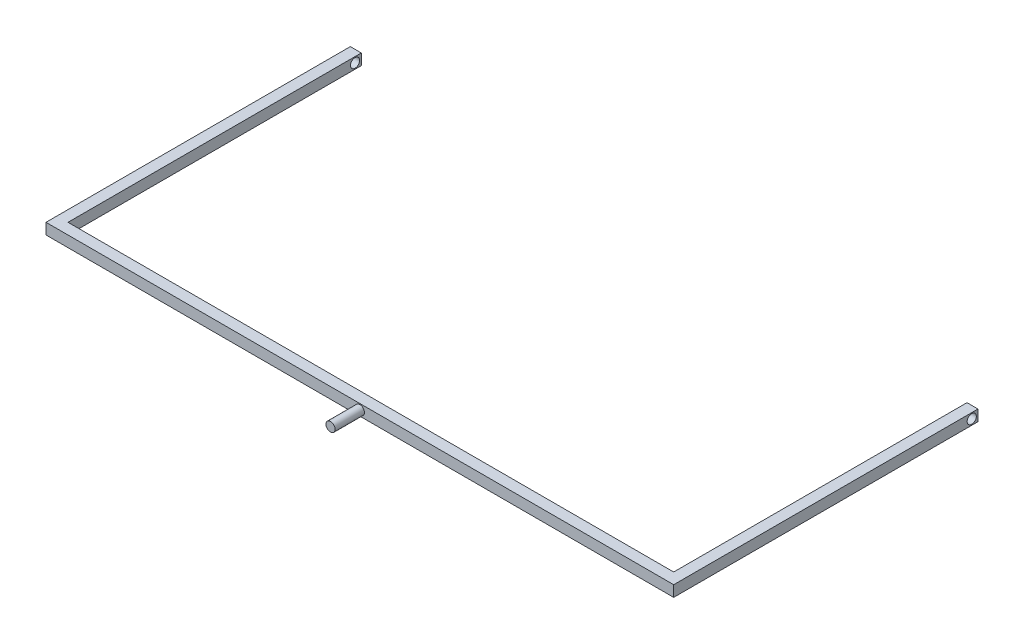
ISO-10303-21;
HEADER;
FILE_DESCRIPTION(('STEP AP214'),'2;1');
FILE_NAME('part.step','',(''),(''),'','','');
FILE_SCHEMA(('AUTOMOTIVE_DESIGN { 1 0 10303 214 1 1 1 1 }'));
ENDSEC;
DATA;
#1=APPLICATION_CONTEXT('core data for automotive mechanical design processes');
#2=APPLICATION_PROTOCOL_DEFINITION('international standard','automotive_design',2000,#1);
#3=PRODUCT_CONTEXT('',#1,'mechanical');
#4=PRODUCT('Part','Part','',(#3));
#5=PRODUCT_RELATED_PRODUCT_CATEGORY('part','',(#4));
#6=PRODUCT_DEFINITION_FORMATION('','',#4);
#7=PRODUCT_DEFINITION_CONTEXT('part definition',#1,'design');
#8=PRODUCT_DEFINITION('design','',#6,#7);
#9=PRODUCT_DEFINITION_SHAPE('','',#8);
#10=(LENGTH_UNIT() NAMED_UNIT(*) SI_UNIT(.MILLI.,.METRE.));
#11=(NAMED_UNIT(*) PLANE_ANGLE_UNIT() SI_UNIT($,.RADIAN.));
#12=(NAMED_UNIT(*) SI_UNIT($,.STERADIAN.) SOLID_ANGLE_UNIT());
#13=UNCERTAINTY_MEASURE_WITH_UNIT(LENGTH_MEASURE(1.E-05),#10,'distance_accuracy_value','');
#14=(GEOMETRIC_REPRESENTATION_CONTEXT(3) GLOBAL_UNCERTAINTY_ASSIGNED_CONTEXT((#13)) GLOBAL_UNIT_ASSIGNED_CONTEXT((#10,
#11,#12)) REPRESENTATION_CONTEXT('',''));
#15=CARTESIAN_POINT('',(0.,0.,0.));
#16=DIRECTION('',(0.,0.,1.));
#17=DIRECTION('',(1.,0.,0.));
#18=AXIS2_PLACEMENT_3D('',#15,#16,#17);
#19=CARTESIAN_POINT('',(-641.999999999998,30.,0.));
#20=DIRECTION('',(1.,0.,0.));
#21=DIRECTION('',(0.,0.,-1.));
#22=AXIS2_PLACEMENT_3D('',#19,#20,#21);
#23=PLANE('',#22);
#24=CARTESIAN_POINT('',(-641.999999999998,15.,-813.));
#25=DIRECTION('',(-1.,0.,0.));
#26=DIRECTION('',(0.,0.,1.));
#27=AXIS2_PLACEMENT_3D('',#24,#25,#26);
#28=CIRCLE('',#27,12.5);
#29=CARTESIAN_POINT('',(-641.999999999998,15.,-800.5));
#30=VERTEX_POINT('',#29);
#31=EDGE_CURVE('E215',#30,#30,#28,.T.);
#32=ORIENTED_EDGE('',*,*,#31,.F.);
#33=EDGE_LOOP('',(#32));
#34=FACE_BOUND('',#33,.T.);
#35=DIRECTION('',(0.,0.,1.));
#36=VECTOR('',#35,1.);
#37=CARTESIAN_POINT('',(-641.999999999998,0.,0.));
#38=LINE('',#37,#36);
#39=CARTESIAN_POINT('',(-641.999999999998,0.,-830.));
#40=VERTEX_POINT('',#39);
#41=CARTESIAN_POINT('',(-641.999999999998,0.,0.));
#42=VERTEX_POINT('',#41);
#43=EDGE_CURVE('E144',#40,#42,#38,.T.);
#44=ORIENTED_EDGE('',*,*,#43,.T.);
#45=DIRECTION('',(0.,-1.,0.));
#46=VECTOR('',#45,1.);
#47=CARTESIAN_POINT('',(-641.999999999998,30.,0.));
#48=LINE('',#47,#46);
#49=CARTESIAN_POINT('',(-641.999999999998,30.,0.));
#50=VERTEX_POINT('',#49);
#51=EDGE_CURVE('E11',#50,#42,#48,.T.);
#52=ORIENTED_EDGE('',*,*,#51,.F.);
#53=DIRECTION('',(0.,0.,1.));
#54=VECTOR('',#53,1.);
#55=CARTESIAN_POINT('',(-641.999999999998,30.,0.));
#56=LINE('',#55,#54);
#57=CARTESIAN_POINT('',(-641.999999999998,30.,-830.));
#58=VERTEX_POINT('',#57);
#59=EDGE_CURVE('E167',#58,#50,#56,.T.);
#60=ORIENTED_EDGE('',*,*,#59,.F.);
#61=DIRECTION('',(0.,-1.,0.));
#62=VECTOR('',#61,1.);
#63=CARTESIAN_POINT('',(-641.999999999998,30.,-830.));
#64=LINE('',#63,#62);
#65=EDGE_CURVE('E140',#58,#40,#64,.T.);
#66=ORIENTED_EDGE('',*,*,#65,.T.);
#67=EDGE_LOOP('',(#44,#52,#60,#66));
#68=FACE_BOUND('',#67,.T.);
#69=ADVANCED_FACE('F42',(#34,#68),#23,.F.);
#70=CARTESIAN_POINT('',(1070.,30.,-1.31037207508767E-13));
#71=DIRECTION('',(0.,0.,-1.));
#72=DIRECTION('',(-1.,0.,0.));
#73=AXIS2_PLACEMENT_3D('',#70,#71,#72);
#74=PLANE('',#73);
#75=CARTESIAN_POINT('',(214.000000000002,15.,0.));
#76=DIRECTION('',(0.,0.,1.));
#77=DIRECTION('',(1.,0.,0.));
#78=AXIS2_PLACEMENT_3D('',#75,#76,#77);
#79=CIRCLE('',#78,12.5);
#80=CARTESIAN_POINT('',(226.500000000002,15.,0.));
#81=VERTEX_POINT('',#80);
#82=EDGE_CURVE('E220',#81,#81,#79,.T.);
#83=ORIENTED_EDGE('',*,*,#82,.F.);
#84=EDGE_LOOP('',(#83));
#85=FACE_BOUND('',#84,.T.);
#86=DIRECTION('',(1.,0.,0.));
#87=VECTOR('',#86,1.);
#88=CARTESIAN_POINT('',(1070.,0.,-1.31037207508767E-13));
#89=LINE('',#88,#87);
#90=CARTESIAN_POINT('',(1070.,0.,-1.31037207508767E-13));
#91=VERTEX_POINT('',#90);
#92=EDGE_CURVE('E148',#42,#91,#89,.T.);
#93=ORIENTED_EDGE('',*,*,#92,.T.);
#94=DIRECTION('',(0.,-1.,0.));
#95=VECTOR('',#94,1.);
#96=CARTESIAN_POINT('',(1070.,30.,-1.31037207508767E-13));
#97=LINE('',#96,#95);
#98=CARTESIAN_POINT('',(1070.,30.,-1.31037207508767E-13));
#99=VERTEX_POINT('',#98);
#100=EDGE_CURVE('E52',#99,#91,#97,.T.);
#101=ORIENTED_EDGE('',*,*,#100,.F.);
#102=DIRECTION('',(1.,0.,0.));
#103=VECTOR('',#102,1.);
#104=CARTESIAN_POINT('',(1070.,30.,-1.31037207508767E-13));
#105=LINE('',#104,#103);
#106=EDGE_CURVE('E103',#50,#99,#105,.T.);
#107=ORIENTED_EDGE('',*,*,#106,.F.);
#108=ORIENTED_EDGE('',*,*,#51,.T.);
#109=EDGE_LOOP('',(#93,#101,#107,#108));
#110=FACE_BOUND('',#109,.T.);
#111=ADVANCED_FACE('F244',(#85,#110),#74,.F.);
#112=CARTESIAN_POINT('',(1070.,30.,-1.31037207508767E-13));
#113=DIRECTION('',(-1.,0.,0.));
#114=DIRECTION('',(0.,0.,1.));
#115=AXIS2_PLACEMENT_3D('',#112,#113,#114);
#116=PLANE('',#115);
#117=CARTESIAN_POINT('',(1070.,15.,-813.));
#118=DIRECTION('',(-1.,0.,0.));
#119=DIRECTION('',(0.,0.,1.));
#120=AXIS2_PLACEMENT_3D('',#117,#118,#119);
#121=CIRCLE('',#120,12.5);
#122=CARTESIAN_POINT('',(1070.,15.,-800.5));
#123=VERTEX_POINT('',#122);
#124=EDGE_CURVE('E219',#123,#123,#121,.T.);
#125=ORIENTED_EDGE('',*,*,#124,.T.);
#126=EDGE_LOOP('',(#125));
#127=FACE_BOUND('',#126,.T.);
#128=DIRECTION('',(0.,0.,-1.));
#129=VECTOR('',#128,1.);
#130=CARTESIAN_POINT('',(1070.,0.,-1.31037207508767E-13));
#131=LINE('',#130,#129);
#132=CARTESIAN_POINT('',(1070.,0.,-830.));
#133=VERTEX_POINT('',#132);
#134=EDGE_CURVE('E152',#91,#133,#131,.T.);
#135=ORIENTED_EDGE('',*,*,#134,.T.);
#136=DIRECTION('',(0.,-1.,0.));
#137=VECTOR('',#136,1.);
#138=CARTESIAN_POINT('',(1070.,30.,-830.));
#139=LINE('',#138,#137);
#140=CARTESIAN_POINT('',(1070.,30.,-830.));
#141=VERTEX_POINT('',#140);
#142=EDGE_CURVE('E178',#141,#133,#139,.T.);
#143=ORIENTED_EDGE('',*,*,#142,.F.);
#144=DIRECTION('',(0.,0.,-1.));
#145=VECTOR('',#144,1.);
#146=CARTESIAN_POINT('',(1070.,30.,-1.31037207508767E-13));
#147=LINE('',#146,#145);
#148=EDGE_CURVE('E189',#99,#141,#147,.T.);
#149=ORIENTED_EDGE('',*,*,#148,.F.);
#150=ORIENTED_EDGE('',*,*,#100,.T.);
#151=EDGE_LOOP('',(#135,#143,#149,#150));
#152=FACE_BOUND('',#151,.T.);
#153=ADVANCED_FACE('F187',(#127,#152),#116,.F.);
#154=CARTESIAN_POINT('',(1070.,30.,-830.));
#155=DIRECTION('',(0.,0.,1.));
#156=DIRECTION('',(1.,0.,0.));
#157=AXIS2_PLACEMENT_3D('',#154,#155,#156);
#158=PLANE('',#157);
#159=DIRECTION('',(-1.,0.,0.));
#160=VECTOR('',#159,1.);
#161=CARTESIAN_POINT('',(1070.,0.,-830.));
#162=LINE('',#161,#160);
#163=CARTESIAN_POINT('',(1040.,0.,-830.));
#164=VERTEX_POINT('',#163);
#165=EDGE_CURVE('E155',#133,#164,#162,.T.);
#166=ORIENTED_EDGE('',*,*,#165,.T.);
#167=DIRECTION('',(0.,-1.,0.));
#168=VECTOR('',#167,1.);
#169=CARTESIAN_POINT('',(1040.,30.,-830.));
#170=LINE('',#169,#168);
#171=CARTESIAN_POINT('',(1040.,30.,-830.));
#172=VERTEX_POINT('',#171);
#173=EDGE_CURVE('E174',#172,#164,#170,.T.);
#174=ORIENTED_EDGE('',*,*,#173,.F.);
#175=DIRECTION('',(-1.,0.,0.));
#176=VECTOR('',#175,1.);
#177=CARTESIAN_POINT('',(1070.,30.,-830.));
#178=LINE('',#177,#176);
#179=EDGE_CURVE('E202',#141,#172,#178,.T.);
#180=ORIENTED_EDGE('',*,*,#179,.F.);
#181=ORIENTED_EDGE('',*,*,#142,.T.);
#182=EDGE_LOOP('',(#166,#174,#180,#181));
#183=FACE_BOUND('',#182,.T.);
#184=ADVANCED_FACE('F197',(#183),#158,.F.);
#185=CARTESIAN_POINT('',(1040.,30.,-830.));
#186=DIRECTION('',(1.,0.,0.));
#187=DIRECTION('',(0.,0.,-1.));
#188=AXIS2_PLACEMENT_3D('',#185,#186,#187);
#189=PLANE('',#188);
#190=CARTESIAN_POINT('',(1040.,15.,-813.));
#191=DIRECTION('',(1.,0.,0.));
#192=DIRECTION('',(0.,0.,-1.));
#193=AXIS2_PLACEMENT_3D('',#190,#191,#192);
#194=CIRCLE('',#193,12.5);
#195=CARTESIAN_POINT('',(1040.,15.,-825.5));
#196=VERTEX_POINT('',#195);
#197=EDGE_CURVE('E149',#196,#196,#194,.T.);
#198=ORIENTED_EDGE('',*,*,#197,.T.);
#199=EDGE_LOOP('',(#198));
#200=FACE_BOUND('',#199,.T.);
#201=DIRECTION('',(0.,0.,1.));
#202=VECTOR('',#201,1.);
#203=CARTESIAN_POINT('',(1040.,0.,-830.));
#204=LINE('',#203,#202);
#205=CARTESIAN_POINT('',(1040.,0.,-29.9999999999998));
#206=VERTEX_POINT('',#205);
#207=EDGE_CURVE('E158',#164,#206,#204,.T.);
#208=ORIENTED_EDGE('',*,*,#207,.T.);
#209=DIRECTION('',(0.,-1.,0.));
#210=VECTOR('',#209,1.);
#211=CARTESIAN_POINT('',(1040.,30.,-29.9999999999998));
#212=LINE('',#211,#210);
#213=CARTESIAN_POINT('',(1040.,30.,-29.9999999999998));
#214=VERTEX_POINT('',#213);
#215=EDGE_CURVE('E133',#214,#206,#212,.T.);
#216=ORIENTED_EDGE('',*,*,#215,.F.);
#217=DIRECTION('',(0.,0.,1.));
#218=VECTOR('',#217,1.);
#219=CARTESIAN_POINT('',(1040.,30.,-830.));
#220=LINE('',#219,#218);
#221=EDGE_CURVE('E122',#172,#214,#220,.T.);
#222=ORIENTED_EDGE('',*,*,#221,.F.);
#223=ORIENTED_EDGE('',*,*,#173,.T.);
#224=EDGE_LOOP('',(#208,#216,#222,#223));
#225=FACE_BOUND('',#224,.T.);
#226=ADVANCED_FACE('F200',(#200,#225),#189,.F.);
#227=CARTESIAN_POINT('',(-611.999999999998,30.,-29.9999999999998));
#228=DIRECTION('',(0.,0.,1.));
#229=DIRECTION('',(1.,0.,0.));
#230=AXIS2_PLACEMENT_3D('',#227,#228,#229);
#231=PLANE('',#230);
#232=DIRECTION('',(-1.,0.,0.));
#233=VECTOR('',#232,1.);
#234=CARTESIAN_POINT('',(-611.999999999998,0.,-29.9999999999998));
#235=LINE('',#234,#233);
#236=CARTESIAN_POINT('',(-611.999999999998,0.,-29.9999999999998));
#237=VERTEX_POINT('',#236);
#238=EDGE_CURVE('E131',#206,#237,#235,.T.);
#239=ORIENTED_EDGE('',*,*,#238,.T.);
#240=DIRECTION('',(0.,-1.,0.));
#241=VECTOR('',#240,1.);
#242=CARTESIAN_POINT('',(-611.999999999998,30.,-29.9999999999998));
#243=LINE('',#242,#241);
#244=CARTESIAN_POINT('',(-611.999999999998,30.,-29.9999999999998));
#245=VERTEX_POINT('',#244);
#246=EDGE_CURVE('E128',#245,#237,#243,.T.);
#247=ORIENTED_EDGE('',*,*,#246,.F.);
#248=DIRECTION('',(-1.,0.,0.));
#249=VECTOR('',#248,1.);
#250=CARTESIAN_POINT('',(-611.999999999998,30.,-29.9999999999998));
#251=LINE('',#250,#249);
#252=EDGE_CURVE('E116',#214,#245,#251,.T.);
#253=ORIENTED_EDGE('',*,*,#252,.F.);
#254=ORIENTED_EDGE('',*,*,#215,.T.);
#255=EDGE_LOOP('',(#239,#247,#253,#254));
#256=FACE_BOUND('',#255,.T.);
#257=ADVANCED_FACE('F129',(#256),#231,.F.);
#258=CARTESIAN_POINT('',(-611.999999999998,30.,-830.));
#259=DIRECTION('',(-1.,0.,0.));
#260=DIRECTION('',(0.,0.,1.));
#261=AXIS2_PLACEMENT_3D('',#258,#259,#260);
#262=PLANE('',#261);
#263=CARTESIAN_POINT('',(-611.999999999998,15.,-813.));
#264=DIRECTION('',(-1.,0.,0.));
#265=DIRECTION('',(0.,0.,1.));
#266=AXIS2_PLACEMENT_3D('',#263,#264,#265);
#267=CIRCLE('',#266,12.5);
#268=CARTESIAN_POINT('',(-611.999999999998,15.,-800.5));
#269=VERTEX_POINT('',#268);
#270=EDGE_CURVE('E45',#269,#269,#267,.T.);
#271=ORIENTED_EDGE('',*,*,#270,.T.);
#272=EDGE_LOOP('',(#271));
#273=FACE_BOUND('',#272,.T.);
#274=DIRECTION('',(0.,0.,-1.));
#275=VECTOR('',#274,1.);
#276=CARTESIAN_POINT('',(-611.999999999998,0.,-830.));
#277=LINE('',#276,#275);
#278=CARTESIAN_POINT('',(-611.999999999998,0.,-830.));
#279=VERTEX_POINT('',#278);
#280=EDGE_CURVE('E89',#237,#279,#277,.T.);
#281=ORIENTED_EDGE('',*,*,#280,.T.);
#282=DIRECTION('',(0.,-1.,0.));
#283=VECTOR('',#282,1.);
#284=CARTESIAN_POINT('',(-611.999999999998,30.,-830.));
#285=LINE('',#284,#283);
#286=CARTESIAN_POINT('',(-611.999999999998,30.,-830.));
#287=VERTEX_POINT('',#286);
#288=EDGE_CURVE('E134',#287,#279,#285,.T.);
#289=ORIENTED_EDGE('',*,*,#288,.F.);
#290=DIRECTION('',(0.,0.,-1.));
#291=VECTOR('',#290,1.);
#292=CARTESIAN_POINT('',(-611.999999999998,30.,-830.));
#293=LINE('',#292,#291);
#294=EDGE_CURVE('E120',#245,#287,#293,.T.);
#295=ORIENTED_EDGE('',*,*,#294,.F.);
#296=ORIENTED_EDGE('',*,*,#246,.T.);
#297=EDGE_LOOP('',(#281,#289,#295,#296));
#298=FACE_BOUND('',#297,.T.);
#299=ADVANCED_FACE('F136',(#273,#298),#262,.F.);
#300=CARTESIAN_POINT('',(-641.999999999998,30.,-830.));
#301=DIRECTION('',(0.,0.,1.));
#302=DIRECTION('',(1.,0.,0.));
#303=AXIS2_PLACEMENT_3D('',#300,#301,#302);
#304=PLANE('',#303);
#305=DIRECTION('',(-1.,0.,0.));
#306=VECTOR('',#305,1.);
#307=CARTESIAN_POINT('',(-641.999999999998,0.,-830.));
#308=LINE('',#307,#306);
#309=EDGE_CURVE('E95',#279,#40,#308,.T.);
#310=ORIENTED_EDGE('',*,*,#309,.T.);
#311=ORIENTED_EDGE('',*,*,#65,.F.);
#312=DIRECTION('',(-1.,0.,0.));
#313=VECTOR('',#312,1.);
#314=CARTESIAN_POINT('',(-641.999999999998,30.,-830.));
#315=LINE('',#314,#313);
#316=EDGE_CURVE('E60',#287,#58,#315,.T.);
#317=ORIENTED_EDGE('',*,*,#316,.F.);
#318=ORIENTED_EDGE('',*,*,#288,.T.);
#319=EDGE_LOOP('',(#310,#311,#317,#318));
#320=FACE_BOUND('',#319,.T.);
#321=ADVANCED_FACE('F254',(#320),#304,.F.);
#322=CARTESIAN_POINT('',(0.,30.,0.));
#323=DIRECTION('',(0.,-1.,0.));
#324=DIRECTION('',(0.,0.,-1.));
#325=AXIS2_PLACEMENT_3D('',#322,#323,#324);
#326=PLANE('',#325);
#327=ORIENTED_EDGE('',*,*,#59,.T.);
#328=ORIENTED_EDGE('',*,*,#106,.T.);
#329=ORIENTED_EDGE('',*,*,#148,.T.);
#330=ORIENTED_EDGE('',*,*,#179,.T.);
#331=ORIENTED_EDGE('',*,*,#221,.T.);
#332=ORIENTED_EDGE('',*,*,#252,.T.);
#333=ORIENTED_EDGE('',*,*,#294,.T.);
#334=ORIENTED_EDGE('',*,*,#316,.T.);
#335=EDGE_LOOP('',(#327,#328,#329,#330,#331,#332,#333,#334));
#336=FACE_BOUND('',#335,.T.);
#337=ADVANCED_FACE('F118',(#336),#326,.F.);
#338=CARTESIAN_POINT('',(0.,0.,0.));
#339=DIRECTION('',(0.,-1.,0.));
#340=DIRECTION('',(0.,0.,-1.));
#341=AXIS2_PLACEMENT_3D('',#338,#339,#340);
#342=PLANE('',#341);
#343=ORIENTED_EDGE('',*,*,#43,.F.);
#344=ORIENTED_EDGE('',*,*,#309,.F.);
#345=ORIENTED_EDGE('',*,*,#280,.F.);
#346=ORIENTED_EDGE('',*,*,#238,.F.);
#347=ORIENTED_EDGE('',*,*,#207,.F.);
#348=ORIENTED_EDGE('',*,*,#165,.F.);
#349=ORIENTED_EDGE('',*,*,#134,.F.);
#350=ORIENTED_EDGE('',*,*,#92,.F.);
#351=EDGE_LOOP('',(#343,#344,#345,#346,#347,#348,#349,#350));
#352=FACE_BOUND('',#351,.T.);
#353=ADVANCED_FACE('F193',(#352),#342,.T.);
#354=CARTESIAN_POINT('',(1070.,15.,-813.));
#355=DIRECTION('',(-1.,0.,0.));
#356=DIRECTION('',(0.,0.,1.));
#357=AXIS2_PLACEMENT_3D('',#354,#355,#356);
#358=CYLINDRICAL_SURFACE('',#357,12.5);
#359=ORIENTED_EDGE('',*,*,#31,.T.);
#360=EDGE_LOOP('',(#359));
#361=FACE_BOUND('',#360,.T.);
#362=ORIENTED_EDGE('',*,*,#270,.F.);
#363=EDGE_LOOP('',(#362));
#364=FACE_BOUND('',#363,.T.);
#365=ADVANCED_FACE('F281',(#361,#364),#358,.F.);
#366=ORIENTED_EDGE('',*,*,#124,.F.);
#367=EDGE_LOOP('',(#366));
#368=FACE_BOUND('',#367,.T.);
#369=ORIENTED_EDGE('',*,*,#197,.F.);
#370=EDGE_LOOP('',(#369));
#371=FACE_BOUND('',#370,.T.);
#372=ADVANCED_FACE('F241',(#368,#371),#358,.F.);
#373=CARTESIAN_POINT('',(214.000000000002,15.,80.0000000000002));
#374=DIRECTION('',(0.,0.,-1.));
#375=DIRECTION('',(-1.,0.,0.));
#376=AXIS2_PLACEMENT_3D('',#373,#374,#375);
#377=CYLINDRICAL_SURFACE('',#376,12.5);
#378=CARTESIAN_POINT('',(214.000000000002,15.,80.0000000000002));
#379=DIRECTION('',(0.,0.,-1.));
#380=DIRECTION('',(-1.,0.,0.));
#381=AXIS2_PLACEMENT_3D('',#378,#379,#380);
#382=CIRCLE('',#381,12.5);
#383=CARTESIAN_POINT('',(201.500000000002,15.,80.0000000000002));
#384=VERTEX_POINT('',#383);
#385=EDGE_CURVE('E227',#384,#384,#382,.T.);
#386=ORIENTED_EDGE('',*,*,#385,.T.);
#387=EDGE_LOOP('',(#386));
#388=FACE_BOUND('',#387,.T.);
#389=ORIENTED_EDGE('',*,*,#82,.T.);
#390=EDGE_LOOP('',(#389));
#391=FACE_BOUND('',#390,.T.);
#392=ADVANCED_FACE('F232',(#388,#391),#377,.T.);
#393=CARTESIAN_POINT('',(214.000000000002,15.,80.0000000000002));
#394=DIRECTION('',(0.,0.,-1.));
#395=DIRECTION('',(-1.,0.,0.));
#396=AXIS2_PLACEMENT_3D('',#393,#394,#395);
#397=PLANE('',#396);
#398=ORIENTED_EDGE('',*,*,#385,.F.);
#399=EDGE_LOOP('',(#398));
#400=FACE_BOUND('',#399,.T.);
#401=ADVANCED_FACE('F235',(#400),#397,.F.);
#402=CLOSED_SHELL('',(#69,#111,#153,#184,#226,#257,#299,#321,#337,#353,#365,#372,#392,#401));
#403=MANIFOLD_SOLID_BREP('B2',#402);
#404=ADVANCED_BREP_SHAPE_REPRESENTATION('',(#18,#403),#14);
#405=SHAPE_DEFINITION_REPRESENTATION(#9,#404);
ENDSEC;
END-ISO-10303-21;
